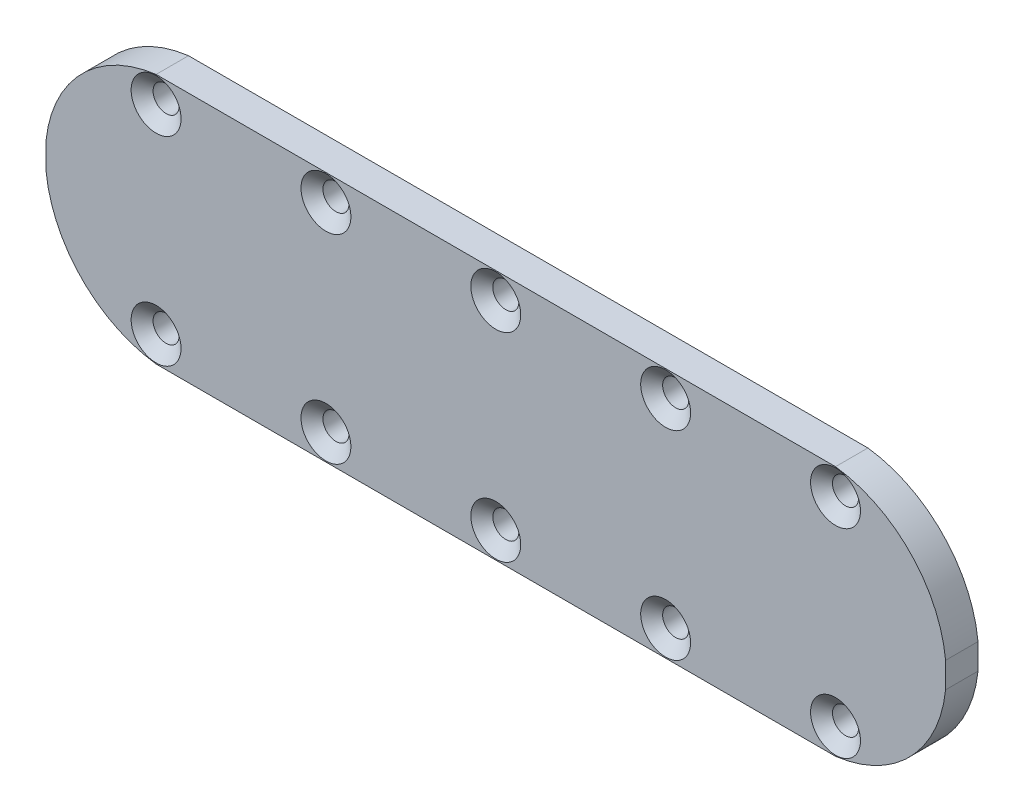
ISO-10303-21;
HEADER;
FILE_DESCRIPTION(('STEP AP214'),'2;1');
FILE_NAME('part.step','',(''),(''),'','','');
FILE_SCHEMA(('AUTOMOTIVE_DESIGN { 1 0 10303 214 1 1 1 1 }'));
ENDSEC;
DATA;
#1=APPLICATION_CONTEXT('core data for automotive mechanical design processes');
#2=APPLICATION_PROTOCOL_DEFINITION('international standard','automotive_design',2000,#1);
#3=PRODUCT_CONTEXT('',#1,'mechanical');
#4=PRODUCT('Part','Part','',(#3));
#5=PRODUCT_RELATED_PRODUCT_CATEGORY('part','',(#4));
#6=PRODUCT_DEFINITION_FORMATION('','',#4);
#7=PRODUCT_DEFINITION_CONTEXT('part definition',#1,'design');
#8=PRODUCT_DEFINITION('design','',#6,#7);
#9=PRODUCT_DEFINITION_SHAPE('','',#8);
#10=(LENGTH_UNIT() NAMED_UNIT(*) SI_UNIT(.MILLI.,.METRE.));
#11=(NAMED_UNIT(*) PLANE_ANGLE_UNIT() SI_UNIT($,.RADIAN.));
#12=(NAMED_UNIT(*) SI_UNIT($,.STERADIAN.) SOLID_ANGLE_UNIT());
#13=UNCERTAINTY_MEASURE_WITH_UNIT(LENGTH_MEASURE(1.E-05),#10,'distance_accuracy_value','');
#14=(GEOMETRIC_REPRESENTATION_CONTEXT(3) GLOBAL_UNCERTAINTY_ASSIGNED_CONTEXT((#13)) GLOBAL_UNIT_ASSIGNED_CONTEXT((#10,
#11,#12)) REPRESENTATION_CONTEXT('',''));
#15=CARTESIAN_POINT('',(0.,0.,0.));
#16=DIRECTION('',(0.,0.,1.));
#17=DIRECTION('',(1.,0.,0.));
#18=AXIS2_PLACEMENT_3D('',#15,#16,#17);
#19=CARTESIAN_POINT('',(0.,0.,0.));
#20=DIRECTION('',(0.,0.,-1.));
#21=DIRECTION('',(-1.,0.,0.));
#22=AXIS2_PLACEMENT_3D('',#19,#20,#21);
#23=PLANE('',#22);
#24=CARTESIAN_POINT('',(-66.5658073569617,19.4945,0.));
#25=DIRECTION('',(0.,0.,1.));
#26=DIRECTION('',(1.,0.,0.));
#27=AXIS2_PLACEMENT_3D('',#24,#25,#26);
#28=CIRCLE('',#27,2.55270000000001);
#29=CARTESIAN_POINT('',(-64.0131073569617,19.4945,0.));
#30=VERTEX_POINT('',#29);
#31=EDGE_CURVE('E243',#30,#30,#28,.T.);
#32=ORIENTED_EDGE('',*,*,#31,.T.);
#33=EDGE_LOOP('',(#32));
#34=FACE_BOUND('',#33,.T.);
#35=DIRECTION('',(-1.,0.,0.));
#36=VECTOR('',#35,1.);
#37=CARTESIAN_POINT('',(88.1380000000001,24.5745,0.));
#38=LINE('',#37,#36);
#39=CARTESIAN_POINT('',(66.5658073569616,24.5745,0.));
#40=VERTEX_POINT('',#39);
#41=CARTESIAN_POINT('',(-66.5658073569616,24.5745,0.));
#42=VERTEX_POINT('',#41);
#43=EDGE_CURVE('E36',#40,#42,#38,.T.);
#44=ORIENTED_EDGE('',*,*,#43,.F.);
#45=CARTESIAN_POINT('',(63.5,0.,0.));
#46=DIRECTION('',(0.,0.,1.));
#47=DIRECTION('',(1.,0.,0.));
#48=AXIS2_PLACEMENT_3D('',#45,#46,#47);
#49=CIRCLE('',#48,24.765);
#50=CARTESIAN_POINT('',(88.1380000000001,2.50483153126038,0.));
#51=VERTEX_POINT('',#50);
#52=EDGE_CURVE('E147',#51,#40,#49,.T.);
#53=ORIENTED_EDGE('',*,*,#52,.F.);
#54=DIRECTION('',(0.,1.,0.));
#55=VECTOR('',#54,1.);
#56=CARTESIAN_POINT('',(88.1380000000001,24.5745,0.));
#57=LINE('',#56,#55);
#58=CARTESIAN_POINT('',(88.1380000000001,-2.50483153126032,0.));
#59=VERTEX_POINT('',#58);
#60=EDGE_CURVE('E124',#59,#51,#57,.T.);
#61=ORIENTED_EDGE('',*,*,#60,.F.);
#62=CARTESIAN_POINT('',(63.5,0.,0.));
#63=DIRECTION('',(0.,0.,1.));
#64=DIRECTION('',(1.,0.,0.));
#65=AXIS2_PLACEMENT_3D('',#62,#63,#64);
#66=CIRCLE('',#65,24.765);
#67=CARTESIAN_POINT('',(66.5658073569613,-24.5745,0.));
#68=VERTEX_POINT('',#67);
#69=EDGE_CURVE('E123',#68,#59,#66,.T.);
#70=ORIENTED_EDGE('',*,*,#69,.F.);
#71=DIRECTION('',(1.,0.,0.));
#72=VECTOR('',#71,1.);
#73=CARTESIAN_POINT('',(88.1380000000001,-24.5745,0.));
#74=LINE('',#73,#72);
#75=CARTESIAN_POINT('',(-66.5658073569615,-24.5745,0.));
#76=VERTEX_POINT('',#75);
#77=EDGE_CURVE('E115',#76,#68,#74,.T.);
#78=ORIENTED_EDGE('',*,*,#77,.F.);
#79=CARTESIAN_POINT('',(-63.5,0.,0.));
#80=DIRECTION('',(0.,0.,1.));
#81=DIRECTION('',(1.,0.,0.));
#82=AXIS2_PLACEMENT_3D('',#79,#80,#81);
#83=CIRCLE('',#82,24.765);
#84=CARTESIAN_POINT('',(-88.138,-2.50483153126154,0.));
#85=VERTEX_POINT('',#84);
#86=EDGE_CURVE('E98',#85,#76,#83,.T.);
#87=ORIENTED_EDGE('',*,*,#86,.F.);
#88=DIRECTION('',(0.,-1.,0.));
#89=VECTOR('',#88,1.);
#90=CARTESIAN_POINT('',(-88.1379999999999,24.5745,0.));
#91=LINE('',#90,#89);
#92=CARTESIAN_POINT('',(-88.1379999999999,2.50483153126156,0.));
#93=VERTEX_POINT('',#92);
#94=EDGE_CURVE('E125',#93,#85,#91,.T.);
#95=ORIENTED_EDGE('',*,*,#94,.F.);
#96=CARTESIAN_POINT('',(-63.5,0.,0.));
#97=DIRECTION('',(0.,0.,1.));
#98=DIRECTION('',(1.,0.,0.));
#99=AXIS2_PLACEMENT_3D('',#96,#97,#98);
#100=CIRCLE('',#99,24.765);
#101=EDGE_CURVE('E140',#42,#93,#100,.T.);
#102=ORIENTED_EDGE('',*,*,#101,.F.);
#103=EDGE_LOOP('',(#44,#53,#61,#70,#78,#87,#95,#102));
#104=FACE_BOUND('',#103,.T.);
#105=CARTESIAN_POINT('',(-66.5658073569615,-19.4945,0.));
#106=DIRECTION('',(0.,0.,1.));
#107=DIRECTION('',(1.,0.,0.));
#108=AXIS2_PLACEMENT_3D('',#105,#106,#107);
#109=CIRCLE('',#108,2.55270000000001);
#110=CARTESIAN_POINT('',(-64.0131073569615,-19.4945,0.));
#111=VERTEX_POINT('',#110);
#112=EDGE_CURVE('E153',#111,#111,#109,.T.);
#113=ORIENTED_EDGE('',*,*,#112,.T.);
#114=EDGE_LOOP('',(#113));
#115=FACE_BOUND('',#114,.T.);
#116=CARTESIAN_POINT('',(-33.2829036784808,-19.4945,0.));
#117=DIRECTION('',(0.,0.,1.));
#118=DIRECTION('',(1.,0.,0.));
#119=AXIS2_PLACEMENT_3D('',#116,#117,#118);
#120=CIRCLE('',#119,2.5527);
#121=CARTESIAN_POINT('',(-30.7302036784808,-19.4945,0.));
#122=VERTEX_POINT('',#121);
#123=EDGE_CURVE('E171',#122,#122,#120,.T.);
#124=ORIENTED_EDGE('',*,*,#123,.T.);
#125=EDGE_LOOP('',(#124));
#126=FACE_BOUND('',#125,.T.);
#127=CARTESIAN_POINT('',(0.,-19.4945,0.));
#128=DIRECTION('',(0.,0.,1.));
#129=DIRECTION('',(1.,0.,0.));
#130=AXIS2_PLACEMENT_3D('',#127,#128,#129);
#131=CIRCLE('',#130,2.5527);
#132=CARTESIAN_POINT('',(2.5526999999999,-19.4945,0.));
#133=VERTEX_POINT('',#132);
#134=EDGE_CURVE('E180',#133,#133,#131,.T.);
#135=ORIENTED_EDGE('',*,*,#134,.T.);
#136=EDGE_LOOP('',(#135));
#137=FACE_BOUND('',#136,.T.);
#138=CARTESIAN_POINT('',(33.2829036784806,-19.4945,0.));
#139=DIRECTION('',(0.,0.,1.));
#140=DIRECTION('',(1.,0.,0.));
#141=AXIS2_PLACEMENT_3D('',#138,#139,#140);
#142=CIRCLE('',#141,2.5527);
#143=CARTESIAN_POINT('',(35.8356036784806,-19.4945,0.));
#144=VERTEX_POINT('',#143);
#145=EDGE_CURVE('E189',#144,#144,#142,.T.);
#146=ORIENTED_EDGE('',*,*,#145,.T.);
#147=EDGE_LOOP('',(#146));
#148=FACE_BOUND('',#147,.T.);
#149=CARTESIAN_POINT('',(66.5658073569613,-19.4945,0.));
#150=DIRECTION('',(0.,0.,1.));
#151=DIRECTION('',(1.,0.,0.));
#152=AXIS2_PLACEMENT_3D('',#149,#150,#151);
#153=CIRCLE('',#152,2.55270000000001);
#154=CARTESIAN_POINT('',(69.1185073569613,-19.4945,0.));
#155=VERTEX_POINT('',#154);
#156=EDGE_CURVE('E198',#155,#155,#153,.T.);
#157=ORIENTED_EDGE('',*,*,#156,.T.);
#158=EDGE_LOOP('',(#157));
#159=FACE_BOUND('',#158,.T.);
#160=CARTESIAN_POINT('',(66.5658073569616,19.4945,0.));
#161=DIRECTION('',(0.,0.,1.));
#162=DIRECTION('',(1.,0.,0.));
#163=AXIS2_PLACEMENT_3D('',#160,#161,#162);
#164=CIRCLE('',#163,2.55270000000001);
#165=CARTESIAN_POINT('',(69.1185073569616,19.4945,0.));
#166=VERTEX_POINT('',#165);
#167=EDGE_CURVE('E207',#166,#166,#164,.T.);
#168=ORIENTED_EDGE('',*,*,#167,.T.);
#169=EDGE_LOOP('',(#168));
#170=FACE_BOUND('',#169,.T.);
#171=CARTESIAN_POINT('',(33.2829036784808,19.4945,0.));
#172=DIRECTION('',(0.,0.,1.));
#173=DIRECTION('',(1.,0.,0.));
#174=AXIS2_PLACEMENT_3D('',#171,#172,#173);
#175=CIRCLE('',#174,2.5527);
#176=CARTESIAN_POINT('',(35.8356036784808,19.4945,0.));
#177=VERTEX_POINT('',#176);
#178=EDGE_CURVE('E216',#177,#177,#175,.T.);
#179=ORIENTED_EDGE('',*,*,#178,.T.);
#180=EDGE_LOOP('',(#179));
#181=FACE_BOUND('',#180,.T.);
#182=CARTESIAN_POINT('',(0.,19.4945,0.));
#183=DIRECTION('',(0.,0.,1.));
#184=DIRECTION('',(1.,0.,0.));
#185=AXIS2_PLACEMENT_3D('',#182,#183,#184);
#186=CIRCLE('',#185,2.5527);
#187=CARTESIAN_POINT('',(2.55269999999999,19.4945,0.));
#188=VERTEX_POINT('',#187);
#189=EDGE_CURVE('E225',#188,#188,#186,.T.);
#190=ORIENTED_EDGE('',*,*,#189,.T.);
#191=EDGE_LOOP('',(#190));
#192=FACE_BOUND('',#191,.T.);
#193=CARTESIAN_POINT('',(-33.2829036784808,19.4945,0.));
#194=DIRECTION('',(0.,0.,1.));
#195=DIRECTION('',(1.,0.,0.));
#196=AXIS2_PLACEMENT_3D('',#193,#194,#195);
#197=CIRCLE('',#196,2.5527);
#198=CARTESIAN_POINT('',(-30.7302036784808,19.4945,0.));
#199=VERTEX_POINT('',#198);
#200=EDGE_CURVE('E234',#199,#199,#197,.T.);
#201=ORIENTED_EDGE('',*,*,#200,.T.);
#202=EDGE_LOOP('',(#201));
#203=FACE_BOUND('',#202,.T.);
#204=ADVANCED_FACE('F32',(#34,#104,#115,#126,#137,#148,#159,#170,#181,#192,#203),#23,.T.);
#205=CARTESIAN_POINT('',(-88.1379999999999,24.5745,6.35));
#206=DIRECTION('',(1.,0.,0.));
#207=DIRECTION('',(0.,1.,0.));
#208=AXIS2_PLACEMENT_3D('',#205,#206,#207);
#209=PLANE('',#208);
#210=DIRECTION('',(0.,0.,1.));
#211=VECTOR('',#210,1.);
#212=CARTESIAN_POINT('',(-88.1379999999999,-2.50483153126155,0.));
#213=LINE('',#212,#211);
#214=CARTESIAN_POINT('',(-88.1379999999999,-2.50483153126155,6.35));
#215=VERTEX_POINT('',#214);
#216=EDGE_CURVE('E104',#85,#215,#213,.T.);
#217=ORIENTED_EDGE('',*,*,#216,.T.);
#218=DIRECTION('',(0.,-1.,0.));
#219=VECTOR('',#218,1.);
#220=CARTESIAN_POINT('',(-88.1379999999999,24.5745,6.35));
#221=LINE('',#220,#219);
#222=CARTESIAN_POINT('',(-88.1379999999999,2.50483153126156,6.35));
#223=VERTEX_POINT('',#222);
#224=EDGE_CURVE('E134',#223,#215,#221,.T.);
#225=ORIENTED_EDGE('',*,*,#224,.F.);
#226=DIRECTION('',(0.,0.,1.));
#227=VECTOR('',#226,1.);
#228=CARTESIAN_POINT('',(-88.1379999999999,2.50483153126156,0.));
#229=LINE('',#228,#227);
#230=EDGE_CURVE('E128',#93,#223,#229,.T.);
#231=ORIENTED_EDGE('',*,*,#230,.F.);
#232=ORIENTED_EDGE('',*,*,#94,.T.);
#233=EDGE_LOOP('',(#217,#225,#231,#232));
#234=FACE_BOUND('',#233,.T.);
#235=ADVANCED_FACE('F34',(#234),#209,.F.);
#236=CARTESIAN_POINT('',(88.1380000000001,-24.5745,6.35));
#237=DIRECTION('',(0.,1.,0.));
#238=DIRECTION('',(-1.,0.,0.));
#239=AXIS2_PLACEMENT_3D('',#236,#237,#238);
#240=PLANE('',#239);
#241=DIRECTION('',(0.,0.,1.));
#242=VECTOR('',#241,1.);
#243=CARTESIAN_POINT('',(66.5658073569613,-24.5745,0.));
#244=LINE('',#243,#242);
#245=CARTESIAN_POINT('',(66.5658073569613,-24.5745,6.35));
#246=VERTEX_POINT('',#245);
#247=EDGE_CURVE('E49',#68,#246,#244,.T.);
#248=ORIENTED_EDGE('',*,*,#247,.T.);
#249=DIRECTION('',(1.,0.,0.));
#250=VECTOR('',#249,1.);
#251=CARTESIAN_POINT('',(88.1380000000001,-24.5745,6.35));
#252=LINE('',#251,#250);
#253=CARTESIAN_POINT('',(-66.5658073569615,-24.5745,6.35));
#254=VERTEX_POINT('',#253);
#255=EDGE_CURVE('E117',#254,#246,#252,.T.);
#256=ORIENTED_EDGE('',*,*,#255,.F.);
#257=DIRECTION('',(0.,0.,1.));
#258=VECTOR('',#257,1.);
#259=CARTESIAN_POINT('',(-66.5658073569615,-24.5745,0.));
#260=LINE('',#259,#258);
#261=EDGE_CURVE('E101',#76,#254,#260,.T.);
#262=ORIENTED_EDGE('',*,*,#261,.F.);
#263=ORIENTED_EDGE('',*,*,#77,.T.);
#264=EDGE_LOOP('',(#248,#256,#262,#263));
#265=FACE_BOUND('',#264,.T.);
#266=ADVANCED_FACE('F114',(#265),#240,.F.);
#267=CARTESIAN_POINT('',(88.1380000000001,24.5745,6.35));
#268=DIRECTION('',(-1.,0.,0.));
#269=DIRECTION('',(0.,0.,1.));
#270=AXIS2_PLACEMENT_3D('',#267,#268,#269);
#271=PLANE('',#270);
#272=DIRECTION('',(0.,0.,1.));
#273=VECTOR('',#272,1.);
#274=CARTESIAN_POINT('',(88.1380000000001,2.50483153126037,0.));
#275=LINE('',#274,#273);
#276=CARTESIAN_POINT('',(88.1380000000001,2.50483153126037,6.35));
#277=VERTEX_POINT('',#276);
#278=EDGE_CURVE('E57',#51,#277,#275,.T.);
#279=ORIENTED_EDGE('',*,*,#278,.T.);
#280=DIRECTION('',(0.,1.,0.));
#281=VECTOR('',#280,1.);
#282=CARTESIAN_POINT('',(88.1380000000001,24.5745,6.35));
#283=LINE('',#282,#281);
#284=CARTESIAN_POINT('',(88.1380000000001,-2.50483153126032,6.35));
#285=VERTEX_POINT('',#284);
#286=EDGE_CURVE('E41',#285,#277,#283,.T.);
#287=ORIENTED_EDGE('',*,*,#286,.F.);
#288=DIRECTION('',(0.,0.,1.));
#289=VECTOR('',#288,1.);
#290=CARTESIAN_POINT('',(88.1380000000001,-2.50483153126032,0.));
#291=LINE('',#290,#289);
#292=EDGE_CURVE('E156',#59,#285,#291,.T.);
#293=ORIENTED_EDGE('',*,*,#292,.F.);
#294=ORIENTED_EDGE('',*,*,#60,.T.);
#295=EDGE_LOOP('',(#279,#287,#293,#294));
#296=FACE_BOUND('',#295,.T.);
#297=ADVANCED_FACE('F291',(#296),#271,.F.);
#298=CARTESIAN_POINT('',(88.1380000000001,24.5745,6.35));
#299=DIRECTION('',(0.,-1.,0.));
#300=DIRECTION('',(1.,0.,0.));
#301=AXIS2_PLACEMENT_3D('',#298,#299,#300);
#302=PLANE('',#301);
#303=DIRECTION('',(0.,0.,1.));
#304=VECTOR('',#303,1.);
#305=CARTESIAN_POINT('',(66.5658073569616,24.5745,0.));
#306=LINE('',#305,#304);
#307=CARTESIAN_POINT('',(66.5658073569616,24.5745,6.35));
#308=VERTEX_POINT('',#307);
#309=EDGE_CURVE('E146',#40,#308,#306,.T.);
#310=ORIENTED_EDGE('',*,*,#309,.F.);
#311=ORIENTED_EDGE('',*,*,#43,.T.);
#312=DIRECTION('',(0.,0.,1.));
#313=VECTOR('',#312,1.);
#314=CARTESIAN_POINT('',(-66.5658073569617,24.5745,0.));
#315=LINE('',#314,#313);
#316=CARTESIAN_POINT('',(-66.5658073569617,24.5745,6.35));
#317=VERTEX_POINT('',#316);
#318=EDGE_CURVE('E137',#42,#317,#315,.T.);
#319=ORIENTED_EDGE('',*,*,#318,.T.);
#320=DIRECTION('',(-1.,0.,0.));
#321=VECTOR('',#320,1.);
#322=CARTESIAN_POINT('',(88.1380000000001,24.5745,6.35));
#323=LINE('',#322,#321);
#324=EDGE_CURVE('E11',#308,#317,#323,.T.);
#325=ORIENTED_EDGE('',*,*,#324,.F.);
#326=EDGE_LOOP('',(#310,#311,#319,#325));
#327=FACE_BOUND('',#326,.T.);
#328=ADVANCED_FACE('F259',(#327),#302,.F.);
#329=CARTESIAN_POINT('',(0.,0.,6.35));
#330=DIRECTION('',(0.,0.,-1.));
#331=DIRECTION('',(-1.,0.,0.));
#332=AXIS2_PLACEMENT_3D('',#329,#330,#331);
#333=PLANE('',#332);
#334=CARTESIAN_POINT('',(-66.5658073569617,19.4945,6.35));
#335=DIRECTION('',(0.,0.,1.));
#336=DIRECTION('',(1.,0.,0.));
#337=AXIS2_PLACEMENT_3D('',#334,#335,#336);
#338=CIRCLE('',#337,4.8895);
#339=CARTESIAN_POINT('',(-61.6763073569617,19.4945,6.35));
#340=VERTEX_POINT('',#339);
#341=EDGE_CURVE('E249',#340,#340,#338,.T.);
#342=ORIENTED_EDGE('',*,*,#341,.F.);
#343=EDGE_LOOP('',(#342));
#344=FACE_BOUND('',#343,.T.);
#345=CARTESIAN_POINT('',(-33.2829036784808,19.4945,6.35));
#346=DIRECTION('',(0.,0.,1.));
#347=DIRECTION('',(1.,0.,0.));
#348=AXIS2_PLACEMENT_3D('',#345,#346,#347);
#349=CIRCLE('',#348,4.8895);
#350=CARTESIAN_POINT('',(-28.3934036784808,19.4945,6.35));
#351=VERTEX_POINT('',#350);
#352=EDGE_CURVE('E240',#351,#351,#349,.T.);
#353=ORIENTED_EDGE('',*,*,#352,.F.);
#354=EDGE_LOOP('',(#353));
#355=FACE_BOUND('',#354,.T.);
#356=CARTESIAN_POINT('',(0.,19.4945,6.35));
#357=DIRECTION('',(0.,0.,1.));
#358=DIRECTION('',(1.,0.,0.));
#359=AXIS2_PLACEMENT_3D('',#356,#357,#358);
#360=CIRCLE('',#359,4.8895);
#361=CARTESIAN_POINT('',(4.88949999999999,19.4945,6.35));
#362=VERTEX_POINT('',#361);
#363=EDGE_CURVE('E231',#362,#362,#360,.T.);
#364=ORIENTED_EDGE('',*,*,#363,.F.);
#365=EDGE_LOOP('',(#364));
#366=FACE_BOUND('',#365,.T.);
#367=CARTESIAN_POINT('',(33.2829036784808,19.4945,6.35));
#368=DIRECTION('',(0.,0.,1.));
#369=DIRECTION('',(1.,0.,0.));
#370=AXIS2_PLACEMENT_3D('',#367,#368,#369);
#371=CIRCLE('',#370,4.8895);
#372=CARTESIAN_POINT('',(38.1724036784808,19.4945,6.35));
#373=VERTEX_POINT('',#372);
#374=EDGE_CURVE('E222',#373,#373,#371,.T.);
#375=ORIENTED_EDGE('',*,*,#374,.F.);
#376=EDGE_LOOP('',(#375));
#377=FACE_BOUND('',#376,.T.);
#378=CARTESIAN_POINT('',(66.5658073569616,19.4945,6.35));
#379=DIRECTION('',(0.,0.,1.));
#380=DIRECTION('',(1.,0.,0.));
#381=AXIS2_PLACEMENT_3D('',#378,#379,#380);
#382=CIRCLE('',#381,4.88950000000001);
#383=CARTESIAN_POINT('',(71.4553073569616,19.4945,6.35));
#384=VERTEX_POINT('',#383);
#385=EDGE_CURVE('E213',#384,#384,#382,.T.);
#386=ORIENTED_EDGE('',*,*,#385,.F.);
#387=EDGE_LOOP('',(#386));
#388=FACE_BOUND('',#387,.T.);
#389=CARTESIAN_POINT('',(66.5658073569613,-19.4945,6.35));
#390=DIRECTION('',(0.,0.,1.));
#391=DIRECTION('',(1.,0.,0.));
#392=AXIS2_PLACEMENT_3D('',#389,#390,#391);
#393=CIRCLE('',#392,4.88950000000001);
#394=CARTESIAN_POINT('',(71.4553073569613,-19.4945,6.35));
#395=VERTEX_POINT('',#394);
#396=EDGE_CURVE('E204',#395,#395,#393,.T.);
#397=ORIENTED_EDGE('',*,*,#396,.F.);
#398=EDGE_LOOP('',(#397));
#399=FACE_BOUND('',#398,.T.);
#400=CARTESIAN_POINT('',(33.2829036784806,-19.4945,6.35));
#401=DIRECTION('',(0.,0.,1.));
#402=DIRECTION('',(1.,0.,0.));
#403=AXIS2_PLACEMENT_3D('',#400,#401,#402);
#404=CIRCLE('',#403,4.8895);
#405=CARTESIAN_POINT('',(38.1724036784806,-19.4945,6.35));
#406=VERTEX_POINT('',#405);
#407=EDGE_CURVE('E195',#406,#406,#404,.T.);
#408=ORIENTED_EDGE('',*,*,#407,.F.);
#409=EDGE_LOOP('',(#408));
#410=FACE_BOUND('',#409,.T.);
#411=CARTESIAN_POINT('',(0.,-19.4945,6.35));
#412=DIRECTION('',(0.,0.,1.));
#413=DIRECTION('',(1.,0.,0.));
#414=AXIS2_PLACEMENT_3D('',#411,#412,#413);
#415=CIRCLE('',#414,4.8895);
#416=CARTESIAN_POINT('',(4.8894999999999,-19.4945,6.35));
#417=VERTEX_POINT('',#416);
#418=EDGE_CURVE('E186',#417,#417,#415,.T.);
#419=ORIENTED_EDGE('',*,*,#418,.F.);
#420=EDGE_LOOP('',(#419));
#421=FACE_BOUND('',#420,.T.);
#422=CARTESIAN_POINT('',(-33.2829036784808,-19.4945,6.35));
#423=DIRECTION('',(0.,0.,1.));
#424=DIRECTION('',(1.,0.,0.));
#425=AXIS2_PLACEMENT_3D('',#422,#423,#424);
#426=CIRCLE('',#425,4.8895);
#427=CARTESIAN_POINT('',(-28.3934036784808,-19.4945,6.35));
#428=VERTEX_POINT('',#427);
#429=EDGE_CURVE('E177',#428,#428,#426,.T.);
#430=ORIENTED_EDGE('',*,*,#429,.F.);
#431=EDGE_LOOP('',(#430));
#432=FACE_BOUND('',#431,.T.);
#433=CARTESIAN_POINT('',(-66.5658073569615,-19.4945,6.35));
#434=DIRECTION('',(0.,0.,1.));
#435=DIRECTION('',(1.,0.,0.));
#436=AXIS2_PLACEMENT_3D('',#433,#434,#435);
#437=CIRCLE('',#436,4.8895);
#438=CARTESIAN_POINT('',(-61.6763073569615,-19.4945,6.35));
#439=VERTEX_POINT('',#438);
#440=EDGE_CURVE('E168',#439,#439,#437,.T.);
#441=ORIENTED_EDGE('',*,*,#440,.F.);
#442=EDGE_LOOP('',(#441));
#443=FACE_BOUND('',#442,.T.);
#444=CARTESIAN_POINT('',(63.5,0.,6.35));
#445=DIRECTION('',(0.,0.,1.));
#446=DIRECTION('',(1.,0.,0.));
#447=AXIS2_PLACEMENT_3D('',#444,#445,#446);
#448=CIRCLE('',#447,24.765);
#449=EDGE_CURVE('E150',#277,#308,#448,.T.);
#450=ORIENTED_EDGE('',*,*,#449,.T.);
#451=ORIENTED_EDGE('',*,*,#324,.T.);
#452=CARTESIAN_POINT('',(-63.5,0.,6.35));
#453=DIRECTION('',(0.,0.,1.));
#454=DIRECTION('',(1.,0.,0.));
#455=AXIS2_PLACEMENT_3D('',#452,#453,#454);
#456=CIRCLE('',#455,24.765);
#457=EDGE_CURVE('E118',#317,#223,#456,.T.);
#458=ORIENTED_EDGE('',*,*,#457,.T.);
#459=ORIENTED_EDGE('',*,*,#224,.T.);
#460=CARTESIAN_POINT('',(-63.5,0.,6.35));
#461=DIRECTION('',(0.,0.,1.));
#462=DIRECTION('',(1.,0.,0.));
#463=AXIS2_PLACEMENT_3D('',#460,#461,#462);
#464=CIRCLE('',#463,24.765);
#465=EDGE_CURVE('E109',#215,#254,#464,.T.);
#466=ORIENTED_EDGE('',*,*,#465,.T.);
#467=ORIENTED_EDGE('',*,*,#255,.T.);
#468=CARTESIAN_POINT('',(63.5,0.,6.35));
#469=DIRECTION('',(0.,0.,1.));
#470=DIRECTION('',(1.,0.,0.));
#471=AXIS2_PLACEMENT_3D('',#468,#469,#470);
#472=CIRCLE('',#471,24.765);
#473=EDGE_CURVE('E149',#246,#285,#472,.T.);
#474=ORIENTED_EDGE('',*,*,#473,.T.);
#475=ORIENTED_EDGE('',*,*,#286,.T.);
#476=EDGE_LOOP('',(#450,#451,#458,#459,#466,#467,#474,#475));
#477=FACE_BOUND('',#476,.T.);
#478=ADVANCED_FACE('F255',(#344,#355,#366,#377,#388,#399,#410,#421,#432,#443,#477),#333,.F.);
#479=CARTESIAN_POINT('',(-63.5,0.,0.));
#480=DIRECTION('',(0.,0.,1.));
#481=DIRECTION('',(1.,0.,0.));
#482=AXIS2_PLACEMENT_3D('',#479,#480,#481);
#483=CYLINDRICAL_SURFACE('',#482,24.765);
#484=ORIENTED_EDGE('',*,*,#457,.F.);
#485=ORIENTED_EDGE('',*,*,#318,.F.);
#486=ORIENTED_EDGE('',*,*,#101,.T.);
#487=ORIENTED_EDGE('',*,*,#230,.T.);
#488=EDGE_LOOP('',(#484,#485,#486,#487));
#489=FACE_BOUND('',#488,.T.);
#490=ADVANCED_FACE('F258',(#489),#483,.T.);
#491=CARTESIAN_POINT('',(-63.5,0.,0.));
#492=DIRECTION('',(0.,0.,1.));
#493=DIRECTION('',(1.,0.,0.));
#494=AXIS2_PLACEMENT_3D('',#491,#492,#493);
#495=CYLINDRICAL_SURFACE('',#494,24.765);
#496=ORIENTED_EDGE('',*,*,#465,.F.);
#497=ORIENTED_EDGE('',*,*,#216,.F.);
#498=ORIENTED_EDGE('',*,*,#86,.T.);
#499=ORIENTED_EDGE('',*,*,#261,.T.);
#500=EDGE_LOOP('',(#496,#497,#498,#499));
#501=FACE_BOUND('',#500,.T.);
#502=ADVANCED_FACE('F100',(#501),#495,.T.);
#503=CARTESIAN_POINT('',(63.5,0.,0.));
#504=DIRECTION('',(0.,0.,1.));
#505=DIRECTION('',(1.,0.,0.));
#506=AXIS2_PLACEMENT_3D('',#503,#504,#505);
#507=CYLINDRICAL_SURFACE('',#506,24.765);
#508=ORIENTED_EDGE('',*,*,#473,.F.);
#509=ORIENTED_EDGE('',*,*,#247,.F.);
#510=ORIENTED_EDGE('',*,*,#69,.T.);
#511=ORIENTED_EDGE('',*,*,#292,.T.);
#512=EDGE_LOOP('',(#508,#509,#510,#511));
#513=FACE_BOUND('',#512,.T.);
#514=ADVANCED_FACE('F295',(#513),#507,.T.);
#515=CARTESIAN_POINT('',(63.5,0.,0.));
#516=DIRECTION('',(0.,0.,1.));
#517=DIRECTION('',(1.,0.,0.));
#518=AXIS2_PLACEMENT_3D('',#515,#516,#517);
#519=CYLINDRICAL_SURFACE('',#518,24.765);
#520=ORIENTED_EDGE('',*,*,#449,.F.);
#521=ORIENTED_EDGE('',*,*,#278,.F.);
#522=ORIENTED_EDGE('',*,*,#52,.T.);
#523=ORIENTED_EDGE('',*,*,#309,.T.);
#524=EDGE_LOOP('',(#520,#521,#522,#523));
#525=FACE_BOUND('',#524,.T.);
#526=ADVANCED_FACE('F292',(#525),#519,.T.);
#527=CARTESIAN_POINT('',(-66.5658073569615,-19.4945,6.35));
#528=DIRECTION('',(0.,0.,1.));
#529=DIRECTION('',(1.,0.,0.));
#530=AXIS2_PLACEMENT_3D('',#527,#528,#529);
#531=CYLINDRICAL_SURFACE('',#530,2.55270000000001);
#532=ORIENTED_EDGE('',*,*,#112,.F.);
#533=EDGE_LOOP('',(#532));
#534=FACE_BOUND('',#533,.T.);
#535=CARTESIAN_POINT('',(-66.5658073569615,-19.4945,4.38919198186493));
#536=DIRECTION('',(0.,0.,1.));
#537=DIRECTION('',(1.,0.,0.));
#538=AXIS2_PLACEMENT_3D('',#535,#536,#537);
#539=CIRCLE('',#538,2.55270000000001);
#540=CARTESIAN_POINT('',(-64.0131073569615,-19.4945,4.38919198186493));
#541=VERTEX_POINT('',#540);
#542=EDGE_CURVE('E165',#541,#541,#539,.T.);
#543=ORIENTED_EDGE('',*,*,#542,.T.);
#544=EDGE_LOOP('',(#543));
#545=FACE_BOUND('',#544,.T.);
#546=ADVANCED_FACE('F294',(#534,#545),#531,.F.);
#547=CARTESIAN_POINT('',(-66.5658073569615,-19.4945,6.35));
#548=DIRECTION('',(0.,0.,1.));
#549=DIRECTION('',(1.,0.,0.));
#550=AXIS2_PLACEMENT_3D('',#547,#548,#549);
#551=CONICAL_SURFACE('',#550,4.8895,0.872664625997164);
#552=ORIENTED_EDGE('',*,*,#542,.F.);
#553=EDGE_LOOP('',(#552));
#554=FACE_BOUND('',#553,.T.);
#555=ORIENTED_EDGE('',*,*,#440,.T.);
#556=EDGE_LOOP('',(#555));
#557=FACE_BOUND('',#556,.T.);
#558=ADVANCED_FACE('F302',(#554,#557),#551,.F.);
#559=CARTESIAN_POINT('',(-33.2829036784808,-19.4945,6.35));
#560=DIRECTION('',(0.,0.,1.));
#561=DIRECTION('',(1.,0.,0.));
#562=AXIS2_PLACEMENT_3D('',#559,#560,#561);
#563=CYLINDRICAL_SURFACE('',#562,2.5527);
#564=ORIENTED_EDGE('',*,*,#123,.F.);
#565=EDGE_LOOP('',(#564));
#566=FACE_BOUND('',#565,.T.);
#567=CARTESIAN_POINT('',(-33.2829036784808,-19.4945,4.38919198186493));
#568=DIRECTION('',(0.,0.,1.));
#569=DIRECTION('',(1.,0.,0.));
#570=AXIS2_PLACEMENT_3D('',#567,#568,#569);
#571=CIRCLE('',#570,2.5527);
#572=CARTESIAN_POINT('',(-30.7302036784808,-19.4945,4.38919198186493));
#573=VERTEX_POINT('',#572);
#574=EDGE_CURVE('E174',#573,#573,#571,.T.);
#575=ORIENTED_EDGE('',*,*,#574,.T.);
#576=EDGE_LOOP('',(#575));
#577=FACE_BOUND('',#576,.T.);
#578=ADVANCED_FACE('F373',(#566,#577),#563,.F.);
#579=CARTESIAN_POINT('',(-33.2829036784808,-19.4945,6.35));
#580=DIRECTION('',(0.,0.,1.));
#581=DIRECTION('',(1.,0.,0.));
#582=AXIS2_PLACEMENT_3D('',#579,#580,#581);
#583=CONICAL_SURFACE('',#582,4.8895,0.872664625997165);
#584=ORIENTED_EDGE('',*,*,#574,.F.);
#585=EDGE_LOOP('',(#584));
#586=FACE_BOUND('',#585,.T.);
#587=ORIENTED_EDGE('',*,*,#429,.T.);
#588=EDGE_LOOP('',(#587));
#589=FACE_BOUND('',#588,.T.);
#590=ADVANCED_FACE('F382',(#586,#589),#583,.F.);
#591=CARTESIAN_POINT('',(0.,-19.4945,6.35));
#592=DIRECTION('',(0.,0.,1.));
#593=DIRECTION('',(1.,0.,0.));
#594=AXIS2_PLACEMENT_3D('',#591,#592,#593);
#595=CYLINDRICAL_SURFACE('',#594,2.5527);
#596=ORIENTED_EDGE('',*,*,#134,.F.);
#597=EDGE_LOOP('',(#596));
#598=FACE_BOUND('',#597,.T.);
#599=CARTESIAN_POINT('',(0.,-19.4945,4.38919198186493));
#600=DIRECTION('',(0.,0.,1.));
#601=DIRECTION('',(1.,0.,0.));
#602=AXIS2_PLACEMENT_3D('',#599,#600,#601);
#603=CIRCLE('',#602,2.5527);
#604=CARTESIAN_POINT('',(2.5526999999999,-19.4945,4.38919198186493));
#605=VERTEX_POINT('',#604);
#606=EDGE_CURVE('E183',#605,#605,#603,.T.);
#607=ORIENTED_EDGE('',*,*,#606,.T.);
#608=EDGE_LOOP('',(#607));
#609=FACE_BOUND('',#608,.T.);
#610=ADVANCED_FACE('F391',(#598,#609),#595,.F.);
#611=CARTESIAN_POINT('',(0.,-19.4945,6.35));
#612=DIRECTION('',(0.,0.,1.));
#613=DIRECTION('',(1.,0.,0.));
#614=AXIS2_PLACEMENT_3D('',#611,#612,#613);
#615=CONICAL_SURFACE('',#614,4.8895,0.872664625997165);
#616=ORIENTED_EDGE('',*,*,#606,.F.);
#617=EDGE_LOOP('',(#616));
#618=FACE_BOUND('',#617,.T.);
#619=ORIENTED_EDGE('',*,*,#418,.T.);
#620=EDGE_LOOP('',(#619));
#621=FACE_BOUND('',#620,.T.);
#622=ADVANCED_FACE('F400',(#618,#621),#615,.F.);
#623=CARTESIAN_POINT('',(33.2829036784806,-19.4945,6.35));
#624=DIRECTION('',(0.,0.,1.));
#625=DIRECTION('',(1.,0.,0.));
#626=AXIS2_PLACEMENT_3D('',#623,#624,#625);
#627=CYLINDRICAL_SURFACE('',#626,2.5527);
#628=ORIENTED_EDGE('',*,*,#145,.F.);
#629=EDGE_LOOP('',(#628));
#630=FACE_BOUND('',#629,.T.);
#631=CARTESIAN_POINT('',(33.2829036784806,-19.4945,4.38919198186493));
#632=DIRECTION('',(0.,0.,1.));
#633=DIRECTION('',(1.,0.,0.));
#634=AXIS2_PLACEMENT_3D('',#631,#632,#633);
#635=CIRCLE('',#634,2.5527);
#636=CARTESIAN_POINT('',(35.8356036784806,-19.4945,4.38919198186493));
#637=VERTEX_POINT('',#636);
#638=EDGE_CURVE('E192',#637,#637,#635,.T.);
#639=ORIENTED_EDGE('',*,*,#638,.T.);
#640=EDGE_LOOP('',(#639));
#641=FACE_BOUND('',#640,.T.);
#642=ADVANCED_FACE('F409',(#630,#641),#627,.F.);
#643=CARTESIAN_POINT('',(33.2829036784806,-19.4945,6.35));
#644=DIRECTION('',(0.,0.,1.));
#645=DIRECTION('',(1.,0.,0.));
#646=AXIS2_PLACEMENT_3D('',#643,#644,#645);
#647=CONICAL_SURFACE('',#646,4.8895,0.872664625997165);
#648=ORIENTED_EDGE('',*,*,#638,.F.);
#649=EDGE_LOOP('',(#648));
#650=FACE_BOUND('',#649,.T.);
#651=ORIENTED_EDGE('',*,*,#407,.T.);
#652=EDGE_LOOP('',(#651));
#653=FACE_BOUND('',#652,.T.);
#654=ADVANCED_FACE('F418',(#650,#653),#647,.F.);
#655=CARTESIAN_POINT('',(66.5658073569613,-19.4945,6.35));
#656=DIRECTION('',(0.,0.,1.));
#657=DIRECTION('',(1.,0.,0.));
#658=AXIS2_PLACEMENT_3D('',#655,#656,#657);
#659=CYLINDRICAL_SURFACE('',#658,2.55270000000001);
#660=ORIENTED_EDGE('',*,*,#156,.F.);
#661=EDGE_LOOP('',(#660));
#662=FACE_BOUND('',#661,.T.);
#663=CARTESIAN_POINT('',(66.5658073569613,-19.4945,4.38919198186493));
#664=DIRECTION('',(0.,0.,1.));
#665=DIRECTION('',(1.,0.,0.));
#666=AXIS2_PLACEMENT_3D('',#663,#664,#665);
#667=CIRCLE('',#666,2.55270000000001);
#668=CARTESIAN_POINT('',(69.1185073569613,-19.4945,4.38919198186493));
#669=VERTEX_POINT('',#668);
#670=EDGE_CURVE('E201',#669,#669,#667,.T.);
#671=ORIENTED_EDGE('',*,*,#670,.T.);
#672=EDGE_LOOP('',(#671));
#673=FACE_BOUND('',#672,.T.);
#674=ADVANCED_FACE('F427',(#662,#673),#659,.F.);
#675=CARTESIAN_POINT('',(66.5658073569613,-19.4945,6.35));
#676=DIRECTION('',(0.,0.,1.));
#677=DIRECTION('',(1.,0.,0.));
#678=AXIS2_PLACEMENT_3D('',#675,#676,#677);
#679=CONICAL_SURFACE('',#678,4.88950000000001,0.872664625997165);
#680=ORIENTED_EDGE('',*,*,#670,.F.);
#681=EDGE_LOOP('',(#680));
#682=FACE_BOUND('',#681,.T.);
#683=ORIENTED_EDGE('',*,*,#396,.T.);
#684=EDGE_LOOP('',(#683));
#685=FACE_BOUND('',#684,.T.);
#686=ADVANCED_FACE('F436',(#682,#685),#679,.F.);
#687=CARTESIAN_POINT('',(66.5658073569616,19.4945,6.35));
#688=DIRECTION('',(0.,0.,1.));
#689=DIRECTION('',(1.,0.,0.));
#690=AXIS2_PLACEMENT_3D('',#687,#688,#689);
#691=CYLINDRICAL_SURFACE('',#690,2.55270000000001);
#692=ORIENTED_EDGE('',*,*,#167,.F.);
#693=EDGE_LOOP('',(#692));
#694=FACE_BOUND('',#693,.T.);
#695=CARTESIAN_POINT('',(66.5658073569616,19.4945,4.38919198186493));
#696=DIRECTION('',(0.,0.,1.));
#697=DIRECTION('',(1.,0.,0.));
#698=AXIS2_PLACEMENT_3D('',#695,#696,#697);
#699=CIRCLE('',#698,2.55270000000001);
#700=CARTESIAN_POINT('',(69.1185073569616,19.4945,4.38919198186493));
#701=VERTEX_POINT('',#700);
#702=EDGE_CURVE('E210',#701,#701,#699,.T.);
#703=ORIENTED_EDGE('',*,*,#702,.T.);
#704=EDGE_LOOP('',(#703));
#705=FACE_BOUND('',#704,.T.);
#706=ADVANCED_FACE('F445',(#694,#705),#691,.F.);
#707=CARTESIAN_POINT('',(66.5658073569616,19.4945,6.35));
#708=DIRECTION('',(0.,0.,1.));
#709=DIRECTION('',(1.,0.,0.));
#710=AXIS2_PLACEMENT_3D('',#707,#708,#709);
#711=CONICAL_SURFACE('',#710,4.88950000000001,0.872664625997165);
#712=ORIENTED_EDGE('',*,*,#702,.F.);
#713=EDGE_LOOP('',(#712));
#714=FACE_BOUND('',#713,.T.);
#715=ORIENTED_EDGE('',*,*,#385,.T.);
#716=EDGE_LOOP('',(#715));
#717=FACE_BOUND('',#716,.T.);
#718=ADVANCED_FACE('F454',(#714,#717),#711,.F.);
#719=CARTESIAN_POINT('',(33.2829036784808,19.4945,6.35));
#720=DIRECTION('',(0.,0.,1.));
#721=DIRECTION('',(1.,0.,0.));
#722=AXIS2_PLACEMENT_3D('',#719,#720,#721);
#723=CYLINDRICAL_SURFACE('',#722,2.5527);
#724=ORIENTED_EDGE('',*,*,#178,.F.);
#725=EDGE_LOOP('',(#724));
#726=FACE_BOUND('',#725,.T.);
#727=CARTESIAN_POINT('',(33.2829036784808,19.4945,4.38919198186493));
#728=DIRECTION('',(0.,0.,1.));
#729=DIRECTION('',(1.,0.,0.));
#730=AXIS2_PLACEMENT_3D('',#727,#728,#729);
#731=CIRCLE('',#730,2.5527);
#732=CARTESIAN_POINT('',(35.8356036784808,19.4945,4.38919198186493));
#733=VERTEX_POINT('',#732);
#734=EDGE_CURVE('E219',#733,#733,#731,.T.);
#735=ORIENTED_EDGE('',*,*,#734,.T.);
#736=EDGE_LOOP('',(#735));
#737=FACE_BOUND('',#736,.T.);
#738=ADVANCED_FACE('F463',(#726,#737),#723,.F.);
#739=CARTESIAN_POINT('',(33.2829036784808,19.4945,6.35));
#740=DIRECTION('',(0.,0.,1.));
#741=DIRECTION('',(1.,0.,0.));
#742=AXIS2_PLACEMENT_3D('',#739,#740,#741);
#743=CONICAL_SURFACE('',#742,4.8895,0.872664625997165);
#744=ORIENTED_EDGE('',*,*,#734,.F.);
#745=EDGE_LOOP('',(#744));
#746=FACE_BOUND('',#745,.T.);
#747=ORIENTED_EDGE('',*,*,#374,.T.);
#748=EDGE_LOOP('',(#747));
#749=FACE_BOUND('',#748,.T.);
#750=ADVANCED_FACE('F472',(#746,#749),#743,.F.);
#751=CARTESIAN_POINT('',(0.,19.4945,6.35));
#752=DIRECTION('',(0.,0.,1.));
#753=DIRECTION('',(1.,0.,0.));
#754=AXIS2_PLACEMENT_3D('',#751,#752,#753);
#755=CYLINDRICAL_SURFACE('',#754,2.5527);
#756=ORIENTED_EDGE('',*,*,#189,.F.);
#757=EDGE_LOOP('',(#756));
#758=FACE_BOUND('',#757,.T.);
#759=CARTESIAN_POINT('',(0.,19.4945,4.38919198186493));
#760=DIRECTION('',(0.,0.,1.));
#761=DIRECTION('',(1.,0.,0.));
#762=AXIS2_PLACEMENT_3D('',#759,#760,#761);
#763=CIRCLE('',#762,2.5527);
#764=CARTESIAN_POINT('',(2.55269999999999,19.4945,4.38919198186493));
#765=VERTEX_POINT('',#764);
#766=EDGE_CURVE('E228',#765,#765,#763,.T.);
#767=ORIENTED_EDGE('',*,*,#766,.T.);
#768=EDGE_LOOP('',(#767));
#769=FACE_BOUND('',#768,.T.);
#770=ADVANCED_FACE('F481',(#758,#769),#755,.F.);
#771=CARTESIAN_POINT('',(0.,19.4945,6.35));
#772=DIRECTION('',(0.,0.,1.));
#773=DIRECTION('',(1.,0.,0.));
#774=AXIS2_PLACEMENT_3D('',#771,#772,#773);
#775=CONICAL_SURFACE('',#774,4.8895,0.872664625997165);
#776=ORIENTED_EDGE('',*,*,#766,.F.);
#777=EDGE_LOOP('',(#776));
#778=FACE_BOUND('',#777,.T.);
#779=ORIENTED_EDGE('',*,*,#363,.T.);
#780=EDGE_LOOP('',(#779));
#781=FACE_BOUND('',#780,.T.);
#782=ADVANCED_FACE('F490',(#778,#781),#775,.F.);
#783=CARTESIAN_POINT('',(-33.2829036784808,19.4945,6.35));
#784=DIRECTION('',(0.,0.,1.));
#785=DIRECTION('',(1.,0.,0.));
#786=AXIS2_PLACEMENT_3D('',#783,#784,#785);
#787=CYLINDRICAL_SURFACE('',#786,2.5527);
#788=ORIENTED_EDGE('',*,*,#200,.F.);
#789=EDGE_LOOP('',(#788));
#790=FACE_BOUND('',#789,.T.);
#791=CARTESIAN_POINT('',(-33.2829036784808,19.4945,4.38919198186493));
#792=DIRECTION('',(0.,0.,1.));
#793=DIRECTION('',(1.,0.,0.));
#794=AXIS2_PLACEMENT_3D('',#791,#792,#793);
#795=CIRCLE('',#794,2.5527);
#796=CARTESIAN_POINT('',(-30.7302036784808,19.4945,4.38919198186493));
#797=VERTEX_POINT('',#796);
#798=EDGE_CURVE('E237',#797,#797,#795,.T.);
#799=ORIENTED_EDGE('',*,*,#798,.T.);
#800=EDGE_LOOP('',(#799));
#801=FACE_BOUND('',#800,.T.);
#802=ADVANCED_FACE('F499',(#790,#801),#787,.F.);
#803=CARTESIAN_POINT('',(-33.2829036784808,19.4945,6.35));
#804=DIRECTION('',(0.,0.,1.));
#805=DIRECTION('',(1.,0.,0.));
#806=AXIS2_PLACEMENT_3D('',#803,#804,#805);
#807=CONICAL_SURFACE('',#806,4.8895,0.872664625997165);
#808=ORIENTED_EDGE('',*,*,#798,.F.);
#809=EDGE_LOOP('',(#808));
#810=FACE_BOUND('',#809,.T.);
#811=ORIENTED_EDGE('',*,*,#352,.T.);
#812=EDGE_LOOP('',(#811));
#813=FACE_BOUND('',#812,.T.);
#814=ADVANCED_FACE('F508',(#810,#813),#807,.F.);
#815=CARTESIAN_POINT('',(-66.5658073569617,19.4945,6.35));
#816=DIRECTION('',(0.,0.,1.));
#817=DIRECTION('',(1.,0.,0.));
#818=AXIS2_PLACEMENT_3D('',#815,#816,#817);
#819=CYLINDRICAL_SURFACE('',#818,2.55270000000001);
#820=ORIENTED_EDGE('',*,*,#31,.F.);
#821=EDGE_LOOP('',(#820));
#822=FACE_BOUND('',#821,.T.);
#823=CARTESIAN_POINT('',(-66.5658073569617,19.4945,4.38919198186493));
#824=DIRECTION('',(0.,0.,1.));
#825=DIRECTION('',(1.,0.,0.));
#826=AXIS2_PLACEMENT_3D('',#823,#824,#825);
#827=CIRCLE('',#826,2.55270000000001);
#828=CARTESIAN_POINT('',(-64.0131073569617,19.4945,4.38919198186493));
#829=VERTEX_POINT('',#828);
#830=EDGE_CURVE('E246',#829,#829,#827,.T.);
#831=ORIENTED_EDGE('',*,*,#830,.T.);
#832=EDGE_LOOP('',(#831));
#833=FACE_BOUND('',#832,.T.);
#834=ADVANCED_FACE('F517',(#822,#833),#819,.F.);
#835=CARTESIAN_POINT('',(-66.5658073569617,19.4945,6.35));
#836=DIRECTION('',(0.,0.,1.));
#837=DIRECTION('',(1.,0.,0.));
#838=AXIS2_PLACEMENT_3D('',#835,#836,#837);
#839=CONICAL_SURFACE('',#838,4.8895,0.872664625997164);
#840=ORIENTED_EDGE('',*,*,#830,.F.);
#841=EDGE_LOOP('',(#840));
#842=FACE_BOUND('',#841,.T.);
#843=ORIENTED_EDGE('',*,*,#341,.T.);
#844=EDGE_LOOP('',(#843));
#845=FACE_BOUND('',#844,.T.);
#846=ADVANCED_FACE('F253',(#842,#845),#839,.F.);
#847=CLOSED_SHELL('',(#204,#235,#266,#297,#328,#478,#490,#502,#514,#526,#546,#558,#578,#590,
#610,#622,#642,#654,#674,#686,#706,#718,#738,#750,#770,#782,#802,#814,#834,#846));
#848=MANIFOLD_SOLID_BREP('B2',#847);
#849=ADVANCED_BREP_SHAPE_REPRESENTATION('',(#18,#848),#14);
#850=SHAPE_DEFINITION_REPRESENTATION(#9,#849);
ENDSEC;
END-ISO-10303-21;
